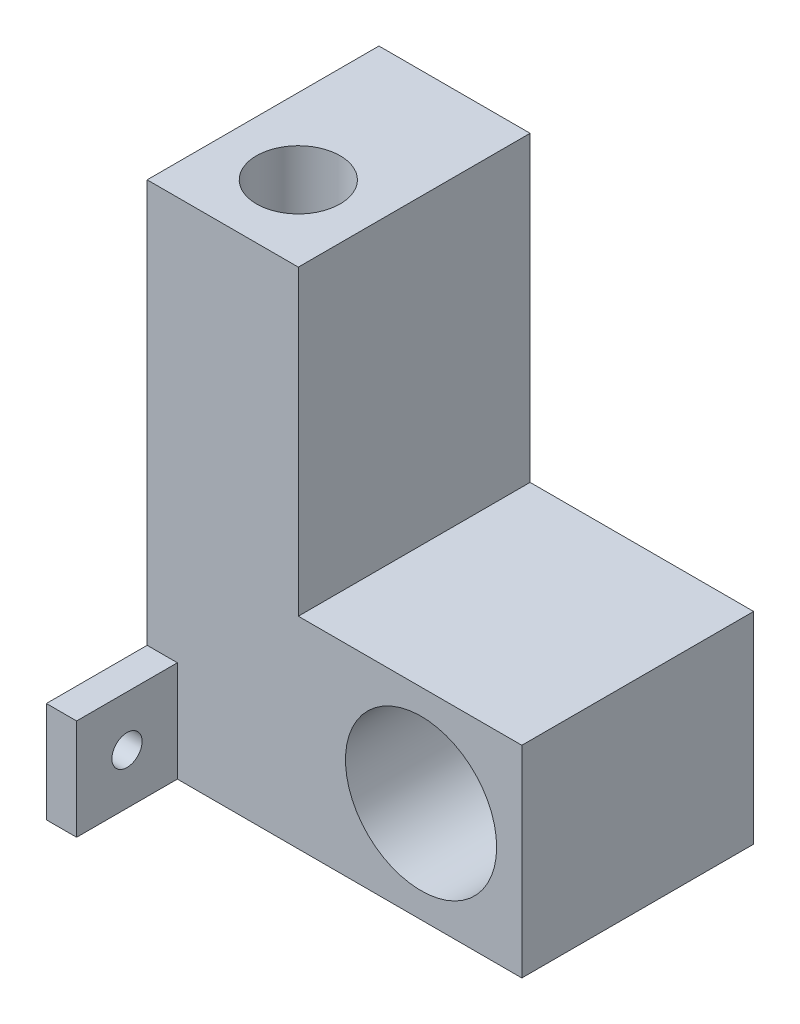
ISO-10303-21;
HEADER;
FILE_DESCRIPTION(('STEP AP214'),'2;1');
FILE_NAME('part.step','',(''),(''),'','','');
FILE_SCHEMA(('AUTOMOTIVE_DESIGN { 1 0 10303 214 1 1 1 1 }'));
ENDSEC;
DATA;
#1=APPLICATION_CONTEXT('core data for automotive mechanical design processes');
#2=APPLICATION_PROTOCOL_DEFINITION('international standard','automotive_design',2000,#1);
#3=PRODUCT_CONTEXT('',#1,'mechanical');
#4=PRODUCT('Part','Part','',(#3));
#5=PRODUCT_RELATED_PRODUCT_CATEGORY('part','',(#4));
#6=PRODUCT_DEFINITION_FORMATION('','',#4);
#7=PRODUCT_DEFINITION_CONTEXT('part definition',#1,'design');
#8=PRODUCT_DEFINITION('design','',#6,#7);
#9=PRODUCT_DEFINITION_SHAPE('','',#8);
#10=(LENGTH_UNIT() NAMED_UNIT(*) SI_UNIT(.MILLI.,.METRE.));
#11=(NAMED_UNIT(*) PLANE_ANGLE_UNIT() SI_UNIT($,.RADIAN.));
#12=(NAMED_UNIT(*) SI_UNIT($,.STERADIAN.) SOLID_ANGLE_UNIT());
#13=UNCERTAINTY_MEASURE_WITH_UNIT(LENGTH_MEASURE(1.E-05),#10,'distance_accuracy_value','');
#14=(GEOMETRIC_REPRESENTATION_CONTEXT(3) GLOBAL_UNCERTAINTY_ASSIGNED_CONTEXT((#13)) GLOBAL_UNIT_ASSIGNED_CONTEXT((#10,
#11,#12)) REPRESENTATION_CONTEXT('',''));
#15=CARTESIAN_POINT('',(0.,0.,0.));
#16=DIRECTION('',(0.,0.,1.));
#17=DIRECTION('',(1.,0.,0.));
#18=AXIS2_PLACEMENT_3D('',#15,#16,#17);
#19=CARTESIAN_POINT('',(0.,-10.,23.));
#20=DIRECTION('',(0.,-1.,0.));
#21=DIRECTION('',(0.,0.,-1.));
#22=AXIS2_PLACEMENT_3D('',#19,#20,#21);
#23=PLANE('',#22);
#24=DIRECTION('',(-1.,0.,0.));
#25=VECTOR('',#24,1.);
#26=CARTESIAN_POINT('',(0.,-10.,23.));
#27=LINE('',#26,#25);
#28=CARTESIAN_POINT('',(10.,-10.,23.));
#29=VERTEX_POINT('',#28);
#30=CARTESIAN_POINT('',(-24.1801195892989,-10.,23.));
#31=VERTEX_POINT('',#30);
#32=EDGE_CURVE('E358',#29,#31,#27,.T.);
#33=ORIENTED_EDGE('',*,*,#32,.T.);
#34=DIRECTION('',(0.,0.,1.));
#35=VECTOR('',#34,1.);
#36=CARTESIAN_POINT('',(-24.1801195892989,-10.,-10.));
#37=LINE('',#36,#35);
#38=CARTESIAN_POINT('',(-24.1801195892989,-10.,33.));
#39=VERTEX_POINT('',#38);
#40=EDGE_CURVE('E302',#31,#39,#37,.T.);
#41=ORIENTED_EDGE('',*,*,#40,.T.);
#42=DIRECTION('',(-1.,0.,0.));
#43=VECTOR('',#42,1.);
#44=CARTESIAN_POINT('',(-24.1801195892989,-10.,33.));
#45=LINE('',#44,#43);
#46=CARTESIAN_POINT('',(-27.1801195892989,-10.,33.));
#47=VERTEX_POINT('',#46);
#48=EDGE_CURVE('E292',#39,#47,#45,.T.);
#49=ORIENTED_EDGE('',*,*,#48,.T.);
#50=DIRECTION('',(0.,0.,-1.));
#51=VECTOR('',#50,1.);
#52=CARTESIAN_POINT('',(-27.1801195892989,-10.,23.));
#53=LINE('',#52,#51);
#54=CARTESIAN_POINT('',(-27.1801195892989,-10.,-10.));
#55=VERTEX_POINT('',#54);
#56=EDGE_CURVE('E286',#47,#55,#53,.T.);
#57=ORIENTED_EDGE('',*,*,#56,.T.);
#58=DIRECTION('',(-1.,0.,0.));
#59=VECTOR('',#58,1.);
#60=CARTESIAN_POINT('',(-24.1801195892989,-10.,-10.));
#61=LINE('',#60,#59);
#62=CARTESIAN_POINT('',(-24.1801195892989,-10.,-10.));
#63=VERTEX_POINT('',#62);
#64=EDGE_CURVE('E280',#63,#55,#61,.T.);
#65=ORIENTED_EDGE('',*,*,#64,.F.);
#66=CARTESIAN_POINT('',(-24.1801195892989,-10.,0.));
#67=VERTEX_POINT('',#66);
#68=EDGE_CURVE('E284',#63,#67,#37,.T.);
#69=ORIENTED_EDGE('',*,*,#68,.T.);
#70=DIRECTION('',(-1.,0.,0.));
#71=VECTOR('',#70,1.);
#72=CARTESIAN_POINT('',(0.,-10.,0.));
#73=LINE('',#72,#71);
#74=CARTESIAN_POINT('',(10.,-10.,0.));
#75=VERTEX_POINT('',#74);
#76=EDGE_CURVE('E212',#75,#67,#73,.T.);
#77=ORIENTED_EDGE('',*,*,#76,.F.);
#78=DIRECTION('',(0.,0.,-1.));
#79=VECTOR('',#78,1.);
#80=CARTESIAN_POINT('',(10.,-10.,23.));
#81=LINE('',#80,#79);
#82=EDGE_CURVE('E377',#29,#75,#81,.T.);
#83=ORIENTED_EDGE('',*,*,#82,.F.);
#84=EDGE_LOOP('',(#33,#41,#49,#57,#65,#69,#77,#83));
#85=FACE_BOUND('',#84,.T.);
#86=CARTESIAN_POINT('',(-19.6801195892989,-10.,15.5));
#87=DIRECTION('',(0.,1.,0.));
#88=DIRECTION('',(0.,0.,1.));
#89=AXIS2_PLACEMENT_3D('',#86,#87,#88);
#90=CIRCLE('',#89,4.15);
#91=CARTESIAN_POINT('',(-19.6801195892989,-10.,19.65));
#92=VERTEX_POINT('',#91);
#93=EDGE_CURVE('E347',#92,#92,#90,.T.);
#94=ORIENTED_EDGE('',*,*,#93,.T.);
#95=EDGE_LOOP('',(#94));
#96=FACE_BOUND('',#95,.T.);
#97=ADVANCED_FACE('F191',(#85,#96),#23,.T.);
#98=CARTESIAN_POINT('',(0.,10.,23.));
#99=DIRECTION('',(0.,1.,0.));
#100=DIRECTION('',(0.,0.,1.));
#101=AXIS2_PLACEMENT_3D('',#98,#99,#100);
#102=PLANE('',#101);
#103=DIRECTION('',(1.,0.,0.));
#104=VECTOR('',#103,1.);
#105=CARTESIAN_POINT('',(0.,10.,0.));
#106=LINE('',#105,#104);
#107=CARTESIAN_POINT('',(-12.1801195892989,10.,0.));
#108=VERTEX_POINT('',#107);
#109=CARTESIAN_POINT('',(10.,10.,0.));
#110=VERTEX_POINT('',#109);
#111=EDGE_CURVE('E380',#108,#110,#106,.T.);
#112=ORIENTED_EDGE('',*,*,#111,.F.);
#113=DIRECTION('',(0.,0.,-1.));
#114=VECTOR('',#113,1.);
#115=CARTESIAN_POINT('',(-12.1801195892989,10.,23.));
#116=LINE('',#115,#114);
#117=CARTESIAN_POINT('',(-12.1801195892989,10.,23.));
#118=VERTEX_POINT('',#117);
#119=EDGE_CURVE('E397',#118,#108,#116,.T.);
#120=ORIENTED_EDGE('',*,*,#119,.F.);
#121=DIRECTION('',(1.,0.,0.));
#122=VECTOR('',#121,1.);
#123=CARTESIAN_POINT('',(0.,10.,23.));
#124=LINE('',#123,#122);
#125=CARTESIAN_POINT('',(10.,10.,23.));
#126=VERTEX_POINT('',#125);
#127=EDGE_CURVE('E362',#118,#126,#124,.T.);
#128=ORIENTED_EDGE('',*,*,#127,.T.);
#129=DIRECTION('',(0.,0.,-1.));
#130=VECTOR('',#129,1.);
#131=CARTESIAN_POINT('',(10.,10.,23.));
#132=LINE('',#131,#130);
#133=EDGE_CURVE('E408',#126,#110,#132,.T.);
#134=ORIENTED_EDGE('',*,*,#133,.T.);
#135=EDGE_LOOP('',(#112,#120,#128,#134));
#136=FACE_BOUND('',#135,.T.);
#137=ADVANCED_FACE('F451',(#136),#102,.T.);
#138=CARTESIAN_POINT('',(-12.1801195892989,0.,23.));
#139=DIRECTION('',(-1.,0.,0.));
#140=DIRECTION('',(0.,0.,1.));
#141=AXIS2_PLACEMENT_3D('',#138,#139,#140);
#142=PLANE('',#141);
#143=DIRECTION('',(0.,1.,0.));
#144=VECTOR('',#143,1.);
#145=CARTESIAN_POINT('',(-12.1801195892989,0.,0.));
#146=LINE('',#145,#144);
#147=CARTESIAN_POINT('',(-12.1801195892989,40.,0.));
#148=VERTEX_POINT('',#147);
#149=EDGE_CURVE('E384',#108,#148,#146,.T.);
#150=ORIENTED_EDGE('',*,*,#149,.T.);
#151=DIRECTION('',(0.,0.,-1.));
#152=VECTOR('',#151,1.);
#153=CARTESIAN_POINT('',(-12.1801195892989,40.,23.));
#154=LINE('',#153,#152);
#155=CARTESIAN_POINT('',(-12.1801195892989,40.,23.));
#156=VERTEX_POINT('',#155);
#157=EDGE_CURVE('E393',#156,#148,#154,.T.);
#158=ORIENTED_EDGE('',*,*,#157,.F.);
#159=DIRECTION('',(0.,1.,0.));
#160=VECTOR('',#159,1.);
#161=CARTESIAN_POINT('',(-12.1801195892989,0.,23.));
#162=LINE('',#161,#160);
#163=EDGE_CURVE('E366',#118,#156,#162,.T.);
#164=ORIENTED_EDGE('',*,*,#163,.F.);
#165=ORIENTED_EDGE('',*,*,#119,.T.);
#166=EDGE_LOOP('',(#150,#158,#164,#165));
#167=FACE_BOUND('',#166,.T.);
#168=ADVANCED_FACE('F460',(#167),#142,.F.);
#169=CARTESIAN_POINT('',(0.,40.,23.));
#170=DIRECTION('',(0.,-1.,0.));
#171=DIRECTION('',(0.,0.,-1.));
#172=AXIS2_PLACEMENT_3D('',#169,#170,#171);
#173=PLANE('',#172);
#174=CARTESIAN_POINT('',(-19.6801195892989,40.,15.5));
#175=DIRECTION('',(0.,1.,0.));
#176=DIRECTION('',(0.,0.,1.));
#177=AXIS2_PLACEMENT_3D('',#174,#175,#176);
#178=CIRCLE('',#177,4.15);
#179=CARTESIAN_POINT('',(-19.6801195892989,40.,19.65));
#180=VERTEX_POINT('',#179);
#181=EDGE_CURVE('E346',#180,#180,#178,.T.);
#182=ORIENTED_EDGE('',*,*,#181,.F.);
#183=EDGE_LOOP('',(#182));
#184=FACE_BOUND('',#183,.T.);
#185=DIRECTION('',(-1.,0.,0.));
#186=VECTOR('',#185,1.);
#187=CARTESIAN_POINT('',(0.,40.,0.));
#188=LINE('',#187,#186);
#189=CARTESIAN_POINT('',(-27.1801195892989,40.,0.));
#190=VERTEX_POINT('',#189);
#191=EDGE_CURVE('E359',#148,#190,#188,.T.);
#192=ORIENTED_EDGE('',*,*,#191,.T.);
#193=DIRECTION('',(0.,0.,-1.));
#194=VECTOR('',#193,1.);
#195=CARTESIAN_POINT('',(-27.1801195892989,40.,23.));
#196=LINE('',#195,#194);
#197=CARTESIAN_POINT('',(-27.1801195892989,40.,23.));
#198=VERTEX_POINT('',#197);
#199=EDGE_CURVE('E373',#198,#190,#196,.T.);
#200=ORIENTED_EDGE('',*,*,#199,.F.);
#201=DIRECTION('',(-1.,0.,0.));
#202=VECTOR('',#201,1.);
#203=CARTESIAN_POINT('',(0.,40.,23.));
#204=LINE('',#203,#202);
#205=EDGE_CURVE('E369',#156,#198,#204,.T.);
#206=ORIENTED_EDGE('',*,*,#205,.F.);
#207=ORIENTED_EDGE('',*,*,#157,.T.);
#208=EDGE_LOOP('',(#192,#200,#206,#207));
#209=FACE_BOUND('',#208,.T.);
#210=ADVANCED_FACE('F462',(#184,#209),#173,.F.);
#211=CARTESIAN_POINT('',(-27.1801195892989,0.,23.));
#212=DIRECTION('',(-1.,0.,0.));
#213=DIRECTION('',(0.,0.,1.));
#214=AXIS2_PLACEMENT_3D('',#211,#212,#213);
#215=PLANE('',#214);
#216=DIRECTION('',(0.,1.,0.));
#217=VECTOR('',#216,1.);
#218=CARTESIAN_POINT('',(-27.1801195892989,0.,0.));
#219=LINE('',#218,#217);
#220=CARTESIAN_POINT('',(-27.1801195892989,0.,0.));
#221=VERTEX_POINT('',#220);
#222=EDGE_CURVE('E374',#221,#190,#219,.T.);
#223=ORIENTED_EDGE('',*,*,#222,.F.);
#224=DIRECTION('',(0.,0.,-1.));
#225=VECTOR('',#224,1.);
#226=CARTESIAN_POINT('',(-27.1801195892989,0.,-10.));
#227=LINE('',#226,#225);
#228=CARTESIAN_POINT('',(-27.1801195892989,0.,-10.));
#229=VERTEX_POINT('',#228);
#230=EDGE_CURVE('E313',#221,#229,#227,.T.);
#231=ORIENTED_EDGE('',*,*,#230,.T.);
#232=DIRECTION('',(0.,-1.,0.));
#233=VECTOR('',#232,1.);
#234=CARTESIAN_POINT('',(-27.1801195892989,-10.,-10.));
#235=LINE('',#234,#233);
#236=EDGE_CURVE('E326',#229,#55,#235,.T.);
#237=ORIENTED_EDGE('',*,*,#236,.T.);
#238=ORIENTED_EDGE('',*,*,#56,.F.);
#239=DIRECTION('',(0.,1.,0.));
#240=VECTOR('',#239,1.);
#241=CARTESIAN_POINT('',(-27.1801195892989,-10.,33.));
#242=LINE('',#241,#240);
#243=CARTESIAN_POINT('',(-27.1801195892989,0.,33.));
#244=VERTEX_POINT('',#243);
#245=EDGE_CURVE('E329',#47,#244,#242,.T.);
#246=ORIENTED_EDGE('',*,*,#245,.T.);
#247=CARTESIAN_POINT('',(-27.1801195892989,0.,23.));
#248=VERTEX_POINT('',#247);
#249=EDGE_CURVE('E309',#244,#248,#227,.T.);
#250=ORIENTED_EDGE('',*,*,#249,.T.);
#251=DIRECTION('',(0.,1.,0.));
#252=VECTOR('',#251,1.);
#253=CARTESIAN_POINT('',(-27.1801195892989,0.,23.));
#254=LINE('',#253,#252);
#255=EDGE_CURVE('E355',#248,#198,#254,.T.);
#256=ORIENTED_EDGE('',*,*,#255,.T.);
#257=ORIENTED_EDGE('',*,*,#199,.T.);
#258=EDGE_LOOP('',(#223,#231,#237,#238,#246,#250,#256,#257));
#259=FACE_BOUND('',#258,.T.);
#260=CARTESIAN_POINT('',(-27.1801195892989,-5.,28.));
#261=DIRECTION('',(-1.,0.,0.));
#262=DIRECTION('',(0.,0.,1.));
#263=AXIS2_PLACEMENT_3D('',#260,#261,#262);
#264=CIRCLE('',#263,1.5);
#265=CARTESIAN_POINT('',(-27.1801195892989,-5.,29.5));
#266=VERTEX_POINT('',#265);
#267=EDGE_CURVE('E520',#266,#266,#264,.T.);
#268=ORIENTED_EDGE('',*,*,#267,.F.);
#269=EDGE_LOOP('',(#268));
#270=FACE_BOUND('',#269,.T.);
#271=CARTESIAN_POINT('',(-27.1801195892989,-5.,-5.));
#272=DIRECTION('',(-1.,0.,0.));
#273=DIRECTION('',(0.,0.,1.));
#274=AXIS2_PLACEMENT_3D('',#271,#272,#273);
#275=CIRCLE('',#274,1.5);
#276=CARTESIAN_POINT('',(-27.1801195892989,-5.,-3.5));
#277=VERTEX_POINT('',#276);
#278=EDGE_CURVE('E316',#277,#277,#275,.T.);
#279=ORIENTED_EDGE('',*,*,#278,.F.);
#280=EDGE_LOOP('',(#279));
#281=FACE_BOUND('',#280,.T.);
#282=ADVANCED_FACE('F438',(#259,#270,#281),#215,.T.);
#283=CARTESIAN_POINT('',(0.,0.,0.));
#284=DIRECTION('',(0.,0.,1.));
#285=DIRECTION('',(1.,0.,0.));
#286=AXIS2_PLACEMENT_3D('',#283,#284,#285);
#287=PLANE('',#286);
#288=DIRECTION('',(0.,1.,0.));
#289=VECTOR('',#288,1.);
#290=CARTESIAN_POINT('',(-24.1801195892989,0.,0.));
#291=LINE('',#290,#289);
#292=CARTESIAN_POINT('',(-24.1801195892989,0.,0.));
#293=VERTEX_POINT('',#292);
#294=EDGE_CURVE('E207',#67,#293,#291,.T.);
#295=ORIENTED_EDGE('',*,*,#294,.T.);
#296=DIRECTION('',(-1.,0.,0.));
#297=VECTOR('',#296,1.);
#298=CARTESIAN_POINT('',(0.,0.,0.));
#299=LINE('',#298,#297);
#300=EDGE_CURVE('E343',#293,#221,#299,.T.);
#301=ORIENTED_EDGE('',*,*,#300,.T.);
#302=ORIENTED_EDGE('',*,*,#222,.T.);
#303=ORIENTED_EDGE('',*,*,#191,.F.);
#304=ORIENTED_EDGE('',*,*,#149,.F.);
#305=ORIENTED_EDGE('',*,*,#111,.T.);
#306=DIRECTION('',(0.,1.,0.));
#307=VECTOR('',#306,1.);
#308=CARTESIAN_POINT('',(10.,0.,0.));
#309=LINE('',#308,#307);
#310=EDGE_CURVE('E405',#75,#110,#309,.T.);
#311=ORIENTED_EDGE('',*,*,#310,.F.);
#312=ORIENTED_EDGE('',*,*,#76,.T.);
#313=EDGE_LOOP('',(#295,#301,#302,#303,#304,#305,#311,#312));
#314=FACE_BOUND('',#313,.T.);
#315=CARTESIAN_POINT('',(0.,0.,0.));
#316=DIRECTION('',(0.,0.,1.));
#317=DIRECTION('',(1.,0.,0.));
#318=AXIS2_PLACEMENT_3D('',#315,#316,#317);
#319=CIRCLE('',#318,7.5);
#320=CARTESIAN_POINT('',(7.5,0.,0.));
#321=VERTEX_POINT('',#320);
#322=EDGE_CURVE('E351',#321,#321,#319,.T.);
#323=ORIENTED_EDGE('',*,*,#322,.T.);
#324=EDGE_LOOP('',(#323));
#325=FACE_BOUND('',#324,.T.);
#326=ADVANCED_FACE('F455',(#314,#325),#287,.F.);
#327=CARTESIAN_POINT('',(0.,0.,23.));
#328=DIRECTION('',(0.,0.,1.));
#329=DIRECTION('',(1.,0.,0.));
#330=AXIS2_PLACEMENT_3D('',#327,#328,#329);
#331=PLANE('',#330);
#332=DIRECTION('',(-1.,0.,0.));
#333=VECTOR('',#332,1.);
#334=CARTESIAN_POINT('',(0.,0.,23.));
#335=LINE('',#334,#333);
#336=CARTESIAN_POINT('',(-24.1801195892989,0.,23.));
#337=VERTEX_POINT('',#336);
#338=EDGE_CURVE('E12',#337,#248,#335,.T.);
#339=ORIENTED_EDGE('',*,*,#338,.F.);
#340=DIRECTION('',(0.,1.,0.));
#341=VECTOR('',#340,1.);
#342=CARTESIAN_POINT('',(-24.1801195892989,0.,23.));
#343=LINE('',#342,#341);
#344=EDGE_CURVE('E200',#31,#337,#343,.T.);
#345=ORIENTED_EDGE('',*,*,#344,.F.);
#346=ORIENTED_EDGE('',*,*,#32,.F.);
#347=DIRECTION('',(0.,1.,0.));
#348=VECTOR('',#347,1.);
#349=CARTESIAN_POINT('',(10.,0.,23.));
#350=LINE('',#349,#348);
#351=EDGE_CURVE('E402',#29,#126,#350,.T.);
#352=ORIENTED_EDGE('',*,*,#351,.T.);
#353=ORIENTED_EDGE('',*,*,#127,.F.);
#354=ORIENTED_EDGE('',*,*,#163,.T.);
#355=ORIENTED_EDGE('',*,*,#205,.T.);
#356=ORIENTED_EDGE('',*,*,#255,.F.);
#357=EDGE_LOOP('',(#339,#345,#346,#352,#353,#354,#355,#356));
#358=FACE_BOUND('',#357,.T.);
#359=CARTESIAN_POINT('',(0.,0.,23.));
#360=DIRECTION('',(0.,0.,1.));
#361=DIRECTION('',(1.,0.,0.));
#362=AXIS2_PLACEMENT_3D('',#359,#360,#361);
#363=CIRCLE('',#362,7.5);
#364=CARTESIAN_POINT('',(7.5,0.,23.));
#365=VERTEX_POINT('',#364);
#366=EDGE_CURVE('E415',#365,#365,#363,.T.);
#367=ORIENTED_EDGE('',*,*,#366,.F.);
#368=EDGE_LOOP('',(#367));
#369=FACE_BOUND('',#368,.T.);
#370=ADVANCED_FACE('F433',(#358,#369),#331,.T.);
#371=CARTESIAN_POINT('',(10.,0.,23.));
#372=DIRECTION('',(-1.,0.,0.));
#373=DIRECTION('',(0.,-1.,0.));
#374=AXIS2_PLACEMENT_3D('',#371,#372,#373);
#375=PLANE('',#374);
#376=ORIENTED_EDGE('',*,*,#310,.T.);
#377=ORIENTED_EDGE('',*,*,#133,.F.);
#378=ORIENTED_EDGE('',*,*,#351,.F.);
#379=ORIENTED_EDGE('',*,*,#82,.T.);
#380=EDGE_LOOP('',(#376,#377,#378,#379));
#381=FACE_BOUND('',#380,.T.);
#382=ADVANCED_FACE('F453',(#381),#375,.F.);
#383=CARTESIAN_POINT('',(0.,0.,23.));
#384=DIRECTION('',(0.,0.,-1.));
#385=DIRECTION('',(-1.,0.,0.));
#386=AXIS2_PLACEMENT_3D('',#383,#384,#385);
#387=CYLINDRICAL_SURFACE('',#386,7.5);
#388=ORIENTED_EDGE('',*,*,#366,.T.);
#389=EDGE_LOOP('',(#388));
#390=FACE_BOUND('',#389,.T.);
#391=ORIENTED_EDGE('',*,*,#322,.F.);
#392=EDGE_LOOP('',(#391));
#393=FACE_BOUND('',#392,.T.);
#394=ADVANCED_FACE('F193',(#390,#393),#387,.F.);
#395=CARTESIAN_POINT('',(-19.6801195892989,-10.,15.5));
#396=DIRECTION('',(0.,1.,0.));
#397=DIRECTION('',(0.,0.,1.));
#398=AXIS2_PLACEMENT_3D('',#395,#396,#397);
#399=CYLINDRICAL_SURFACE('',#398,4.15);
#400=ORIENTED_EDGE('',*,*,#93,.F.);
#401=EDGE_LOOP('',(#400));
#402=FACE_BOUND('',#401,.T.);
#403=ORIENTED_EDGE('',*,*,#181,.T.);
#404=EDGE_LOOP('',(#403));
#405=FACE_BOUND('',#404,.T.);
#406=ADVANCED_FACE('F485',(#402,#405),#399,.F.);
#407=CARTESIAN_POINT('',(-24.1801195892989,-5.,28.));
#408=DIRECTION('',(-1.,0.,0.));
#409=DIRECTION('',(0.,0.,1.));
#410=AXIS2_PLACEMENT_3D('',#407,#408,#409);
#411=CYLINDRICAL_SURFACE('',#410,1.5);
#412=CARTESIAN_POINT('',(-24.1801195892989,-5.,28.));
#413=DIRECTION('',(-1.,0.,0.));
#414=DIRECTION('',(0.,0.,1.));
#415=AXIS2_PLACEMENT_3D('',#412,#413,#414);
#416=CIRCLE('',#415,1.5);
#417=CARTESIAN_POINT('',(-24.1801195892989,-5.,29.5));
#418=VERTEX_POINT('',#417);
#419=EDGE_CURVE('E517',#418,#418,#416,.T.);
#420=ORIENTED_EDGE('',*,*,#419,.F.);
#421=EDGE_LOOP('',(#420));
#422=FACE_BOUND('',#421,.T.);
#423=ORIENTED_EDGE('',*,*,#267,.T.);
#424=EDGE_LOOP('',(#423));
#425=FACE_BOUND('',#424,.T.);
#426=ADVANCED_FACE('F494',(#422,#425),#411,.F.);
#427=CARTESIAN_POINT('',(-24.1801195892989,-10.,33.));
#428=DIRECTION('',(0.,0.,1.));
#429=DIRECTION('',(1.,0.,0.));
#430=AXIS2_PLACEMENT_3D('',#427,#428,#429);
#431=PLANE('',#430);
#432=ORIENTED_EDGE('',*,*,#245,.F.);
#433=ORIENTED_EDGE('',*,*,#48,.F.);
#434=DIRECTION('',(0.,1.,0.));
#435=VECTOR('',#434,1.);
#436=CARTESIAN_POINT('',(-24.1801195892989,-10.,33.));
#437=LINE('',#436,#435);
#438=CARTESIAN_POINT('',(-24.1801195892989,0.,33.));
#439=VERTEX_POINT('',#438);
#440=EDGE_CURVE('E301',#39,#439,#437,.T.);
#441=ORIENTED_EDGE('',*,*,#440,.T.);
#442=DIRECTION('',(-1.,0.,0.));
#443=VECTOR('',#442,1.);
#444=CARTESIAN_POINT('',(-24.1801195892989,0.,33.));
#445=LINE('',#444,#443);
#446=EDGE_CURVE('E336',#439,#244,#445,.T.);
#447=ORIENTED_EDGE('',*,*,#446,.T.);
#448=EDGE_LOOP('',(#432,#433,#441,#447));
#449=FACE_BOUND('',#448,.T.);
#450=ADVANCED_FACE('F443',(#449),#431,.T.);
#451=CARTESIAN_POINT('',(-24.1801195892989,0.,0.));
#452=DIRECTION('',(1.,0.,0.));
#453=DIRECTION('',(0.,0.,-1.));
#454=AXIS2_PLACEMENT_3D('',#451,#452,#453);
#455=PLANE('',#454);
#456=ORIENTED_EDGE('',*,*,#419,.T.);
#457=EDGE_LOOP('',(#456));
#458=FACE_BOUND('',#457,.T.);
#459=ORIENTED_EDGE('',*,*,#40,.F.);
#460=ORIENTED_EDGE('',*,*,#344,.T.);
#461=DIRECTION('',(0.,0.,-1.));
#462=VECTOR('',#461,1.);
#463=CARTESIAN_POINT('',(-24.1801195892989,0.,-10.));
#464=LINE('',#463,#462);
#465=EDGE_CURVE('E293',#439,#337,#464,.T.);
#466=ORIENTED_EDGE('',*,*,#465,.F.);
#467=ORIENTED_EDGE('',*,*,#440,.F.);
#468=EDGE_LOOP('',(#459,#460,#466,#467));
#469=FACE_BOUND('',#468,.T.);
#470=ADVANCED_FACE('F425',(#458,#469),#455,.T.);
#471=CARTESIAN_POINT('',(-24.1801195892989,0.,-10.));
#472=DIRECTION('',(0.,1.,0.));
#473=DIRECTION('',(0.,0.,1.));
#474=AXIS2_PLACEMENT_3D('',#471,#472,#473);
#475=PLANE('',#474);
#476=ORIENTED_EDGE('',*,*,#465,.T.);
#477=ORIENTED_EDGE('',*,*,#338,.T.);
#478=ORIENTED_EDGE('',*,*,#249,.F.);
#479=ORIENTED_EDGE('',*,*,#446,.F.);
#480=EDGE_LOOP('',(#476,#477,#478,#479));
#481=FACE_BOUND('',#480,.T.);
#482=ADVANCED_FACE('F430',(#481),#475,.T.);
#483=ORIENTED_EDGE('',*,*,#300,.F.);
#484=CARTESIAN_POINT('',(-24.1801195892989,0.,-10.));
#485=VERTEX_POINT('',#484);
#486=EDGE_CURVE('E322',#293,#485,#464,.T.);
#487=ORIENTED_EDGE('',*,*,#486,.T.);
#488=DIRECTION('',(-1.,0.,0.));
#489=VECTOR('',#488,1.);
#490=CARTESIAN_POINT('',(-24.1801195892989,0.,-10.));
#491=LINE('',#490,#489);
#492=EDGE_CURVE('E307',#485,#229,#491,.T.);
#493=ORIENTED_EDGE('',*,*,#492,.T.);
#494=ORIENTED_EDGE('',*,*,#230,.F.);
#495=EDGE_LOOP('',(#483,#487,#493,#494));
#496=FACE_BOUND('',#495,.T.);
#497=ADVANCED_FACE('F503',(#496),#475,.T.);
#498=CARTESIAN_POINT('',(-24.1801195892989,-5.,-5.));
#499=DIRECTION('',(-1.,0.,0.));
#500=DIRECTION('',(0.,0.,1.));
#501=AXIS2_PLACEMENT_3D('',#498,#499,#500);
#502=CIRCLE('',#501,1.5);
#503=CARTESIAN_POINT('',(-24.1801195892989,-5.,-3.5));
#504=VERTEX_POINT('',#503);
#505=EDGE_CURVE('E330',#504,#504,#502,.T.);
#506=ORIENTED_EDGE('',*,*,#505,.T.);
#507=EDGE_LOOP('',(#506));
#508=FACE_BOUND('',#507,.T.);
#509=ORIENTED_EDGE('',*,*,#294,.F.);
#510=ORIENTED_EDGE('',*,*,#68,.F.);
#511=DIRECTION('',(0.,-1.,0.));
#512=VECTOR('',#511,1.);
#513=CARTESIAN_POINT('',(-24.1801195892989,-10.,-10.));
#514=LINE('',#513,#512);
#515=EDGE_CURVE('E299',#485,#63,#514,.T.);
#516=ORIENTED_EDGE('',*,*,#515,.F.);
#517=ORIENTED_EDGE('',*,*,#486,.F.);
#518=EDGE_LOOP('',(#509,#510,#516,#517));
#519=FACE_BOUND('',#518,.T.);
#520=ADVANCED_FACE('F297',(#508,#519),#455,.T.);
#521=CARTESIAN_POINT('',(-24.1801195892989,-10.,-10.));
#522=DIRECTION('',(0.,0.,-1.));
#523=DIRECTION('',(-1.,0.,0.));
#524=AXIS2_PLACEMENT_3D('',#521,#522,#523);
#525=PLANE('',#524);
#526=ORIENTED_EDGE('',*,*,#236,.F.);
#527=ORIENTED_EDGE('',*,*,#492,.F.);
#528=ORIENTED_EDGE('',*,*,#515,.T.);
#529=ORIENTED_EDGE('',*,*,#64,.T.);
#530=EDGE_LOOP('',(#526,#527,#528,#529));
#531=FACE_BOUND('',#530,.T.);
#532=ADVANCED_FACE('F305',(#531),#525,.T.);
#533=CARTESIAN_POINT('',(-24.1801195892989,-5.,-5.));
#534=DIRECTION('',(-1.,0.,0.));
#535=DIRECTION('',(0.,0.,1.));
#536=AXIS2_PLACEMENT_3D('',#533,#534,#535);
#537=CYLINDRICAL_SURFACE('',#536,1.5);
#538=ORIENTED_EDGE('',*,*,#505,.F.);
#539=EDGE_LOOP('',(#538));
#540=FACE_BOUND('',#539,.T.);
#541=ORIENTED_EDGE('',*,*,#278,.T.);
#542=EDGE_LOOP('',(#541));
#543=FACE_BOUND('',#542,.T.);
#544=ADVANCED_FACE('F498',(#540,#543),#537,.F.);
#545=CLOSED_SHELL('',(#97,#137,#168,#210,#282,#326,#370,#382,#394,#406,#426,#450,#470,#482,#497,
#520,#532,#544));
#546=MANIFOLD_SOLID_BREP('B2',#545);
#547=ADVANCED_BREP_SHAPE_REPRESENTATION('',(#18,#546),#14);
#548=SHAPE_DEFINITION_REPRESENTATION(#9,#547);
ENDSEC;
END-ISO-10303-21;
